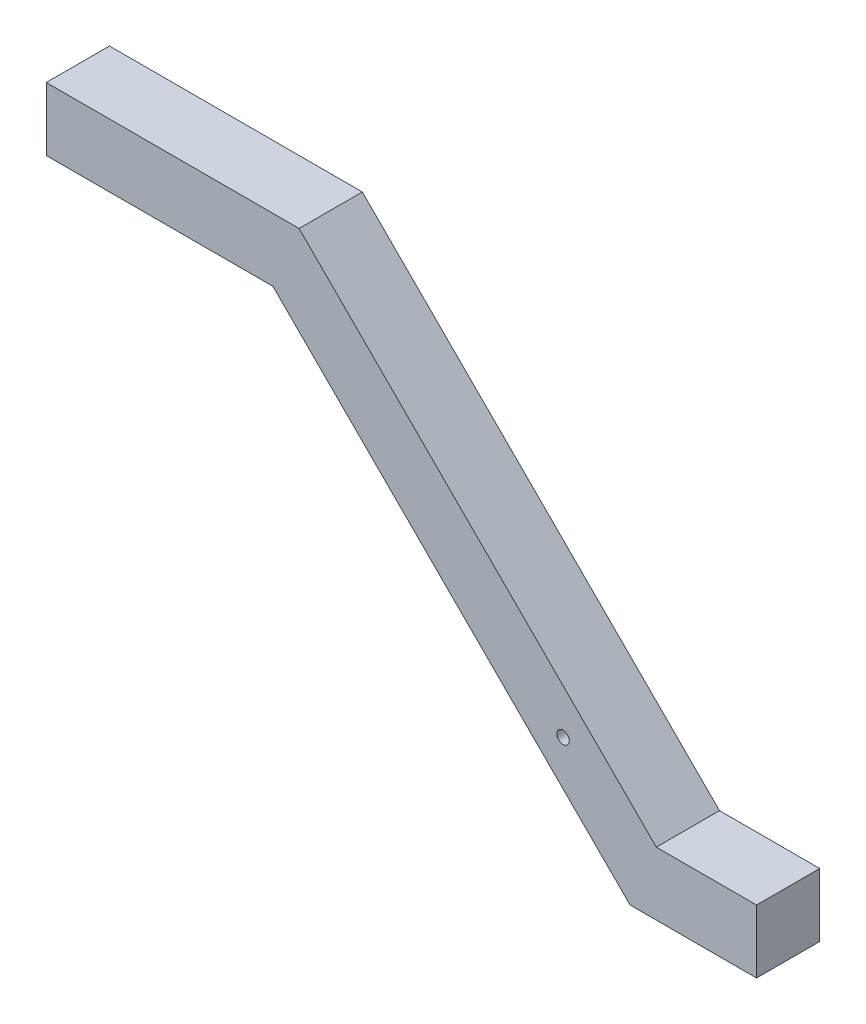
ISO-10303-21;
HEADER;
FILE_DESCRIPTION(('STEP AP214'),'2;1');
FILE_NAME('part.step','',(''),(''),'','','');
FILE_SCHEMA(('AUTOMOTIVE_DESIGN { 1 0 10303 214 1 1 1 1 }'));
ENDSEC;
DATA;
#1=APPLICATION_CONTEXT('core data for automotive mechanical design processes');
#2=APPLICATION_PROTOCOL_DEFINITION('international standard','automotive_design',2000,#1);
#3=PRODUCT_CONTEXT('',#1,'mechanical');
#4=PRODUCT('Part','Part','',(#3));
#5=PRODUCT_RELATED_PRODUCT_CATEGORY('part','',(#4));
#6=PRODUCT_DEFINITION_FORMATION('','',#4);
#7=PRODUCT_DEFINITION_CONTEXT('part definition',#1,'design');
#8=PRODUCT_DEFINITION('design','',#6,#7);
#9=PRODUCT_DEFINITION_SHAPE('','',#8);
#10=(LENGTH_UNIT() NAMED_UNIT(*) SI_UNIT(.MILLI.,.METRE.));
#11=(NAMED_UNIT(*) PLANE_ANGLE_UNIT() SI_UNIT($,.RADIAN.));
#12=(NAMED_UNIT(*) SI_UNIT($,.STERADIAN.) SOLID_ANGLE_UNIT());
#13=UNCERTAINTY_MEASURE_WITH_UNIT(LENGTH_MEASURE(1.E-05),#10,'distance_accuracy_value','');
#14=(GEOMETRIC_REPRESENTATION_CONTEXT(3) GLOBAL_UNCERTAINTY_ASSIGNED_CONTEXT((#13)) GLOBAL_UNIT_ASSIGNED_CONTEXT((#10,
#11,#12)) REPRESENTATION_CONTEXT('',''));
#15=CARTESIAN_POINT('',(0.,0.,0.));
#16=DIRECTION('',(0.,0.,1.));
#17=DIRECTION('',(1.,0.,0.));
#18=AXIS2_PLACEMENT_3D('',#15,#16,#17);
#19=CARTESIAN_POINT('',(-171.120075631963,-42.701612358379,165.4));
#20=DIRECTION('',(0.707106781186547,0.707106781186548,0.));
#21=DIRECTION('',(-0.707106781186548,0.707106781186547,0.));
#22=AXIS2_PLACEMENT_3D('',#19,#20,#21);
#23=PLANE('',#22);
#24=DIRECTION('',(-0.707106781186548,0.707106781186547,0.));
#25=VECTOR('',#24,1.);
#26=CARTESIAN_POINT('',(-171.120075631963,-42.701612358379,165.4));
#27=LINE('',#26,#25);
#28=CARTESIAN_POINT('',(-178.559563389825,-35.2621246005171,165.4));
#29=VERTEX_POINT('',#28);
#30=CARTESIAN_POINT('',(-322.087373415291,108.265685424949,165.4));
#31=VERTEX_POINT('',#30);
#32=EDGE_CURVE('E163',#29,#31,#27,.T.);
#33=ORIENTED_EDGE('',*,*,#32,.F.);
#34=DIRECTION('',(0.,0.,-1.));
#35=VECTOR('',#34,1.);
#36=CARTESIAN_POINT('',(-178.559563389825,-35.2621246005171,165.4));
#37=LINE('',#36,#35);
#38=CARTESIAN_POINT('',(-178.559563389825,-35.2621246005171,140.));
#39=VERTEX_POINT('',#38);
#40=EDGE_CURVE('E11',#29,#39,#37,.T.);
#41=ORIENTED_EDGE('',*,*,#40,.T.);
#42=DIRECTION('',(-0.707106781186548,0.707106781186547,0.));
#43=VECTOR('',#42,1.);
#44=CARTESIAN_POINT('',(-171.120075631963,-42.701612358379,140.));
#45=LINE('',#44,#43);
#46=CARTESIAN_POINT('',(-322.087373415291,108.265685424949,140.));
#47=VERTEX_POINT('',#46);
#48=EDGE_CURVE('E167',#39,#47,#45,.T.);
#49=ORIENTED_EDGE('',*,*,#48,.T.);
#50=DIRECTION('',(0.,0.,-1.));
#51=VECTOR('',#50,1.);
#52=CARTESIAN_POINT('',(-322.087373415291,108.265685424949,165.4));
#53=LINE('',#52,#51);
#54=EDGE_CURVE('E106',#31,#47,#53,.T.);
#55=ORIENTED_EDGE('',*,*,#54,.F.);
#56=EDGE_LOOP('',(#33,#41,#49,#55));
#57=FACE_BOUND('',#56,.T.);
#58=ADVANCED_FACE('F35',(#57),#23,.T.);
#59=CARTESIAN_POINT('',(-171.120075631963,-42.701612358379,165.4));
#60=DIRECTION('',(0.,0.,1.));
#61=DIRECTION('',(1.,0.,0.));
#62=AXIS2_PLACEMENT_3D('',#59,#60,#61);
#63=PLANE('',#62);
#64=DIRECTION('',(1.,0.,0.));
#65=VECTOR('',#64,1.);
#66=CARTESIAN_POINT('',(-423.687373415291,82.8656854249489,165.4));
#67=LINE('',#66,#65);
#68=CARTESIAN_POINT('',(-423.687373415291,82.8656854249489,165.4));
#69=VERTEX_POINT('',#68);
#70=CARTESIAN_POINT('',(-332.608397899569,82.8656854249489,165.4));
#71=VERTEX_POINT('',#70);
#72=EDGE_CURVE('E132',#69,#71,#67,.T.);
#73=ORIENTED_EDGE('',*,*,#72,.T.);
#74=DIRECTION('',(-0.707106781186548,0.707106781186547,0.));
#75=VECTOR('',#74,1.);
#76=CARTESIAN_POINT('',(-189.080587874102,-60.6621246005176,165.4));
#77=LINE('',#76,#75);
#78=CARTESIAN_POINT('',(-189.080587874102,-60.6621246005176,165.4));
#79=VERTEX_POINT('',#78);
#80=EDGE_CURVE('E43',#79,#71,#77,.T.);
#81=ORIENTED_EDGE('',*,*,#80,.F.);
#82=DIRECTION('',(-1.,0.,0.));
#83=VECTOR('',#82,1.);
#84=CARTESIAN_POINT('',(-138.280587874102,-60.6621246005176,165.4));
#85=LINE('',#84,#83);
#86=CARTESIAN_POINT('',(-138.280587874102,-60.6621246005176,165.4));
#87=VERTEX_POINT('',#86);
#88=EDGE_CURVE('E154',#87,#79,#85,.T.);
#89=ORIENTED_EDGE('',*,*,#88,.F.);
#90=DIRECTION('',(0.,-1.,0.));
#91=VECTOR('',#90,1.);
#92=CARTESIAN_POINT('',(-138.280587874102,-60.6621246005176,165.4));
#93=LINE('',#92,#91);
#94=CARTESIAN_POINT('',(-138.280587874102,-35.2621246005171,165.4));
#95=VERTEX_POINT('',#94);
#96=EDGE_CURVE('E137',#95,#87,#93,.T.);
#97=ORIENTED_EDGE('',*,*,#96,.F.);
#98=DIRECTION('',(-1.,0.,0.));
#99=VECTOR('',#98,1.);
#100=CARTESIAN_POINT('',(-138.280587874102,-35.2621246005171,165.4));
#101=LINE('',#100,#99);
#102=EDGE_CURVE('E146',#95,#29,#101,.T.);
#103=ORIENTED_EDGE('',*,*,#102,.T.);
#104=ORIENTED_EDGE('',*,*,#32,.T.);
#105=DIRECTION('',(1.,0.,0.));
#106=VECTOR('',#105,1.);
#107=CARTESIAN_POINT('',(-423.687373415291,108.265685424949,165.4));
#108=LINE('',#107,#106);
#109=CARTESIAN_POINT('',(-423.687373415291,108.265685424949,165.4));
#110=VERTEX_POINT('',#109);
#111=EDGE_CURVE('E110',#110,#31,#108,.T.);
#112=ORIENTED_EDGE('',*,*,#111,.F.);
#113=DIRECTION('',(0.,-1.,0.));
#114=VECTOR('',#113,1.);
#115=CARTESIAN_POINT('',(-423.687373415291,108.265685424949,165.4));
#116=LINE('',#115,#114);
#117=EDGE_CURVE('E121',#110,#69,#116,.T.);
#118=ORIENTED_EDGE('',*,*,#117,.T.);
#119=EDGE_LOOP('',(#73,#81,#89,#97,#103,#104,#112,#118));
#120=FACE_BOUND('',#119,.T.);
#121=CARTESIAN_POINT('',(-216.02135623731,-15.7608439951716,165.4));
#122=DIRECTION('',(0.,0.,1.));
#123=DIRECTION('',(1.,0.,0.));
#124=AXIS2_PLACEMENT_3D('',#121,#122,#123);
#125=CIRCLE('',#124,2.5);
#126=CARTESIAN_POINT('',(-213.52135623731,-15.7608439951716,165.4));
#127=VERTEX_POINT('',#126);
#128=EDGE_CURVE('E157',#127,#127,#125,.T.);
#129=ORIENTED_EDGE('',*,*,#128,.F.);
#130=EDGE_LOOP('',(#129));
#131=FACE_BOUND('',#130,.T.);
#132=ADVANCED_FACE('F37',(#120,#131),#63,.T.);
#133=CARTESIAN_POINT('',(-189.080587874102,-60.6621246005176,165.4));
#134=DIRECTION('',(-0.707106781186547,-0.707106781186548,0.));
#135=DIRECTION('',(0.707106781186548,-0.707106781186547,0.));
#136=AXIS2_PLACEMENT_3D('',#133,#134,#135);
#137=PLANE('',#136);
#138=DIRECTION('',(0.,0.,1.));
#139=VECTOR('',#138,1.);
#140=CARTESIAN_POINT('',(-332.608397899569,82.8656854249489,165.4));
#141=LINE('',#140,#139);
#142=CARTESIAN_POINT('',(-332.608397899569,82.8656854249489,140.));
#143=VERTEX_POINT('',#142);
#144=EDGE_CURVE('E53',#143,#71,#141,.T.);
#145=ORIENTED_EDGE('',*,*,#144,.F.);
#146=DIRECTION('',(-0.707106781186548,0.707106781186547,0.));
#147=VECTOR('',#146,1.);
#148=CARTESIAN_POINT('',(-189.080587874102,-60.6621246005176,140.));
#149=LINE('',#148,#147);
#150=CARTESIAN_POINT('',(-189.080587874102,-60.6621246005176,140.));
#151=VERTEX_POINT('',#150);
#152=EDGE_CURVE('E165',#151,#143,#149,.T.);
#153=ORIENTED_EDGE('',*,*,#152,.F.);
#154=DIRECTION('',(0.,0.,1.));
#155=VECTOR('',#154,1.);
#156=CARTESIAN_POINT('',(-189.080587874102,-60.6621246005176,165.4));
#157=LINE('',#156,#155);
#158=EDGE_CURVE('E161',#151,#79,#157,.T.);
#159=ORIENTED_EDGE('',*,*,#158,.T.);
#160=ORIENTED_EDGE('',*,*,#80,.T.);
#161=EDGE_LOOP('',(#145,#153,#159,#160));
#162=FACE_BOUND('',#161,.T.);
#163=ADVANCED_FACE('F174',(#162),#137,.T.);
#164=CARTESIAN_POINT('',(-171.120075631963,-42.701612358379,140.));
#165=DIRECTION('',(0.,0.,-1.));
#166=DIRECTION('',(-1.,0.,0.));
#167=AXIS2_PLACEMENT_3D('',#164,#165,#166);
#168=PLANE('',#167);
#169=ORIENTED_EDGE('',*,*,#152,.T.);
#170=DIRECTION('',(1.,0.,0.));
#171=VECTOR('',#170,1.);
#172=CARTESIAN_POINT('',(-423.687373415291,82.8656854249489,140.));
#173=LINE('',#172,#171);
#174=CARTESIAN_POINT('',(-423.687373415291,82.8656854249489,140.));
#175=VERTEX_POINT('',#174);
#176=EDGE_CURVE('E126',#175,#143,#173,.T.);
#177=ORIENTED_EDGE('',*,*,#176,.F.);
#178=DIRECTION('',(0.,1.,0.));
#179=VECTOR('',#178,1.);
#180=CARTESIAN_POINT('',(-423.687373415291,108.265685424949,140.));
#181=LINE('',#180,#179);
#182=CARTESIAN_POINT('',(-423.687373415291,108.265685424949,140.));
#183=VERTEX_POINT('',#182);
#184=EDGE_CURVE('E118',#175,#183,#181,.T.);
#185=ORIENTED_EDGE('',*,*,#184,.T.);
#186=DIRECTION('',(1.,0.,0.));
#187=VECTOR('',#186,1.);
#188=CARTESIAN_POINT('',(-423.687373415291,108.265685424949,140.));
#189=LINE('',#188,#187);
#190=EDGE_CURVE('E100',#183,#47,#189,.T.);
#191=ORIENTED_EDGE('',*,*,#190,.T.);
#192=ORIENTED_EDGE('',*,*,#48,.F.);
#193=DIRECTION('',(-1.,0.,0.));
#194=VECTOR('',#193,1.);
#195=CARTESIAN_POINT('',(-138.280587874102,-35.2621246005171,140.));
#196=LINE('',#195,#194);
#197=CARTESIAN_POINT('',(-138.280587874102,-35.2621246005171,140.));
#198=VERTEX_POINT('',#197);
#199=EDGE_CURVE('E149',#198,#39,#196,.T.);
#200=ORIENTED_EDGE('',*,*,#199,.F.);
#201=DIRECTION('',(0.,1.,0.));
#202=VECTOR('',#201,1.);
#203=CARTESIAN_POINT('',(-138.280587874102,-60.6621246005176,140.));
#204=LINE('',#203,#202);
#205=CARTESIAN_POINT('',(-138.280587874102,-60.6621246005176,140.));
#206=VERTEX_POINT('',#205);
#207=EDGE_CURVE('E142',#206,#198,#204,.T.);
#208=ORIENTED_EDGE('',*,*,#207,.F.);
#209=DIRECTION('',(-1.,0.,0.));
#210=VECTOR('',#209,1.);
#211=CARTESIAN_POINT('',(-138.280587874102,-60.6621246005176,140.));
#212=LINE('',#211,#210);
#213=EDGE_CURVE('E151',#206,#151,#212,.T.);
#214=ORIENTED_EDGE('',*,*,#213,.T.);
#215=EDGE_LOOP('',(#169,#177,#185,#191,#192,#200,#208,#214));
#216=FACE_BOUND('',#215,.T.);
#217=CARTESIAN_POINT('',(-216.02135623731,-15.7608439951716,140.));
#218=DIRECTION('',(0.,0.,-1.));
#219=DIRECTION('',(-1.,0.,0.));
#220=AXIS2_PLACEMENT_3D('',#217,#218,#219);
#221=CIRCLE('',#220,2.5);
#222=CARTESIAN_POINT('',(-218.52135623731,-15.7608439951716,140.));
#223=VERTEX_POINT('',#222);
#224=EDGE_CURVE('E156',#223,#223,#221,.T.);
#225=ORIENTED_EDGE('',*,*,#224,.F.);
#226=EDGE_LOOP('',(#225));
#227=FACE_BOUND('',#226,.T.);
#228=ADVANCED_FACE('F123',(#216,#227),#168,.T.);
#229=CARTESIAN_POINT('',(-216.02135623731,-15.7608439951716,138.));
#230=DIRECTION('',(0.,0.,1.));
#231=DIRECTION('',(1.,0.,0.));
#232=AXIS2_PLACEMENT_3D('',#229,#230,#231);
#233=CYLINDRICAL_SURFACE('',#232,2.5);
#234=ORIENTED_EDGE('',*,*,#128,.T.);
#235=EDGE_LOOP('',(#234));
#236=FACE_BOUND('',#235,.T.);
#237=ORIENTED_EDGE('',*,*,#224,.T.);
#238=EDGE_LOOP('',(#237));
#239=FACE_BOUND('',#238,.T.);
#240=ADVANCED_FACE('F172',(#236,#239),#233,.F.);
#241=CARTESIAN_POINT('',(-138.280587874102,-60.6621246005176,165.4));
#242=DIRECTION('',(0.,1.,0.));
#243=DIRECTION('',(0.,0.,1.));
#244=AXIS2_PLACEMENT_3D('',#241,#242,#243);
#245=PLANE('',#244);
#246=ORIENTED_EDGE('',*,*,#158,.F.);
#247=ORIENTED_EDGE('',*,*,#213,.F.);
#248=DIRECTION('',(0.,0.,-1.));
#249=VECTOR('',#248,1.);
#250=CARTESIAN_POINT('',(-138.280587874102,-60.6621246005176,165.4));
#251=LINE('',#250,#249);
#252=EDGE_CURVE('E140',#87,#206,#251,.T.);
#253=ORIENTED_EDGE('',*,*,#252,.F.);
#254=ORIENTED_EDGE('',*,*,#88,.T.);
#255=EDGE_LOOP('',(#246,#247,#253,#254));
#256=FACE_BOUND('',#255,.T.);
#257=ADVANCED_FACE('F180',(#256),#245,.F.);
#258=CARTESIAN_POINT('',(-138.280587874102,-35.2621246005171,165.4));
#259=DIRECTION('',(0.,-1.,0.));
#260=DIRECTION('',(0.,0.,-1.));
#261=AXIS2_PLACEMENT_3D('',#258,#259,#260);
#262=PLANE('',#261);
#263=ORIENTED_EDGE('',*,*,#40,.F.);
#264=ORIENTED_EDGE('',*,*,#102,.F.);
#265=DIRECTION('',(0.,0.,1.));
#266=VECTOR('',#265,1.);
#267=CARTESIAN_POINT('',(-138.280587874102,-35.2621246005171,165.4));
#268=LINE('',#267,#266);
#269=EDGE_CURVE('E144',#198,#95,#268,.T.);
#270=ORIENTED_EDGE('',*,*,#269,.F.);
#271=ORIENTED_EDGE('',*,*,#199,.T.);
#272=EDGE_LOOP('',(#263,#264,#270,#271));
#273=FACE_BOUND('',#272,.T.);
#274=ADVANCED_FACE('F197',(#273),#262,.F.);
#275=CARTESIAN_POINT('',(-138.280587874102,0.,0.));
#276=DIRECTION('',(-1.,0.,0.));
#277=DIRECTION('',(0.,0.,1.));
#278=AXIS2_PLACEMENT_3D('',#275,#276,#277);
#279=PLANE('',#278);
#280=ORIENTED_EDGE('',*,*,#96,.T.);
#281=ORIENTED_EDGE('',*,*,#252,.T.);
#282=ORIENTED_EDGE('',*,*,#207,.T.);
#283=ORIENTED_EDGE('',*,*,#269,.T.);
#284=EDGE_LOOP('',(#280,#281,#282,#283));
#285=FACE_BOUND('',#284,.T.);
#286=ADVANCED_FACE('F202',(#285),#279,.F.);
#287=CARTESIAN_POINT('',(-423.687373415291,82.8656854249489,140.));
#288=DIRECTION('',(0.,-1.,0.));
#289=DIRECTION('',(0.,0.,-1.));
#290=AXIS2_PLACEMENT_3D('',#287,#288,#289);
#291=PLANE('',#290);
#292=ORIENTED_EDGE('',*,*,#176,.T.);
#293=ORIENTED_EDGE('',*,*,#144,.T.);
#294=ORIENTED_EDGE('',*,*,#72,.F.);
#295=DIRECTION('',(0.,0.,-1.));
#296=VECTOR('',#295,1.);
#297=CARTESIAN_POINT('',(-423.687373415291,82.8656854249489,140.));
#298=LINE('',#297,#296);
#299=EDGE_CURVE('E111',#69,#175,#298,.T.);
#300=ORIENTED_EDGE('',*,*,#299,.T.);
#301=EDGE_LOOP('',(#292,#293,#294,#300));
#302=FACE_BOUND('',#301,.T.);
#303=ADVANCED_FACE('F205',(#302),#291,.T.);
#304=CARTESIAN_POINT('',(-423.687373415291,108.265685424949,140.));
#305=DIRECTION('',(0.,1.,0.));
#306=DIRECTION('',(0.,0.,1.));
#307=AXIS2_PLACEMENT_3D('',#304,#305,#306);
#308=PLANE('',#307);
#309=ORIENTED_EDGE('',*,*,#54,.T.);
#310=ORIENTED_EDGE('',*,*,#190,.F.);
#311=DIRECTION('',(0.,0.,1.));
#312=VECTOR('',#311,1.);
#313=CARTESIAN_POINT('',(-423.687373415291,108.265685424949,140.));
#314=LINE('',#313,#312);
#315=EDGE_CURVE('E104',#183,#110,#314,.T.);
#316=ORIENTED_EDGE('',*,*,#315,.T.);
#317=ORIENTED_EDGE('',*,*,#111,.T.);
#318=EDGE_LOOP('',(#309,#310,#316,#317));
#319=FACE_BOUND('',#318,.T.);
#320=ADVANCED_FACE('F102',(#319),#308,.T.);
#321=CARTESIAN_POINT('',(-423.687373415291,0.,0.));
#322=DIRECTION('',(-1.,0.,0.));
#323=DIRECTION('',(0.,0.,1.));
#324=AXIS2_PLACEMENT_3D('',#321,#322,#323);
#325=PLANE('',#324);
#326=ORIENTED_EDGE('',*,*,#184,.F.);
#327=ORIENTED_EDGE('',*,*,#299,.F.);
#328=ORIENTED_EDGE('',*,*,#117,.F.);
#329=ORIENTED_EDGE('',*,*,#315,.F.);
#330=EDGE_LOOP('',(#326,#327,#328,#329));
#331=FACE_BOUND('',#330,.T.);
#332=ADVANCED_FACE('F116',(#331),#325,.T.);
#333=CLOSED_SHELL('',(#58,#132,#163,#228,#240,#257,#274,#286,#303,#320,#332));
#334=MANIFOLD_SOLID_BREP('B2',#333);
#335=ADVANCED_BREP_SHAPE_REPRESENTATION('',(#18,#334),#14);
#336=SHAPE_DEFINITION_REPRESENTATION(#9,#335);
ENDSEC;
END-ISO-10303-21;
